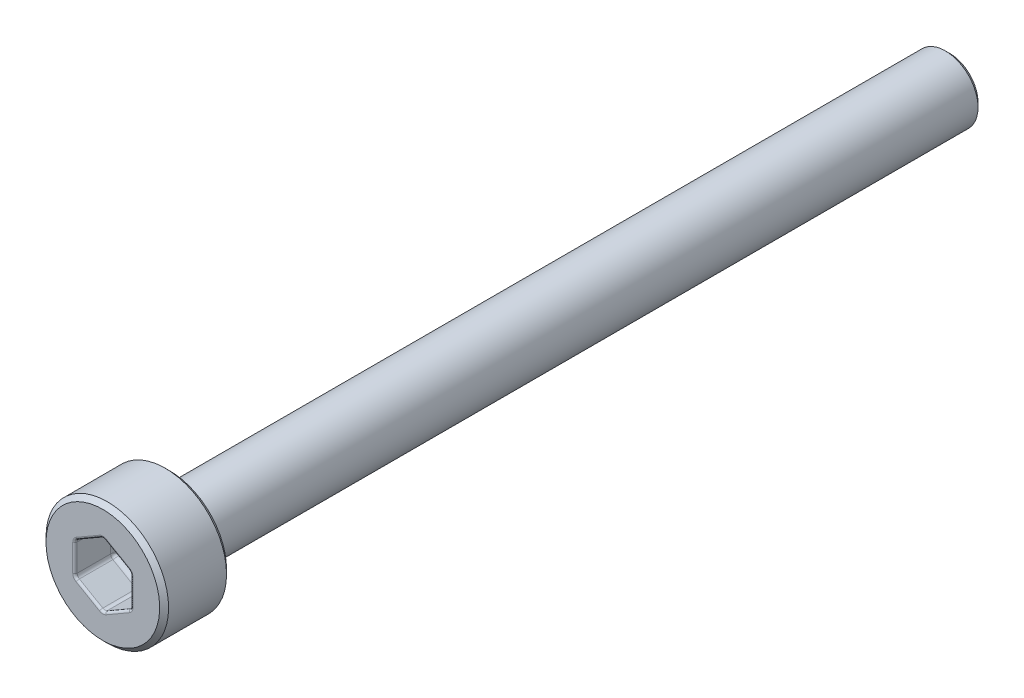
ISO-10303-21;
HEADER;
FILE_DESCRIPTION(('STEP AP214'),'2;1');
FILE_NAME('part.step','',(''),(''),'','','');
FILE_SCHEMA(('AUTOMOTIVE_DESIGN { 1 0 10303 214 1 1 1 1 }'));
ENDSEC;
DATA;
#1=APPLICATION_CONTEXT('core data for automotive mechanical design processes');
#2=APPLICATION_PROTOCOL_DEFINITION('international standard','automotive_design',2000,#1);
#3=PRODUCT_CONTEXT('',#1,'mechanical');
#4=PRODUCT('Part','Part','',(#3));
#5=PRODUCT_RELATED_PRODUCT_CATEGORY('part','',(#4));
#6=PRODUCT_DEFINITION_FORMATION('','',#4);
#7=PRODUCT_DEFINITION_CONTEXT('part definition',#1,'design');
#8=PRODUCT_DEFINITION('design','',#6,#7);
#9=PRODUCT_DEFINITION_SHAPE('','',#8);
#10=(LENGTH_UNIT() NAMED_UNIT(*) SI_UNIT(.MILLI.,.METRE.));
#11=(NAMED_UNIT(*) PLANE_ANGLE_UNIT() SI_UNIT($,.RADIAN.));
#12=(NAMED_UNIT(*) SI_UNIT($,.STERADIAN.) SOLID_ANGLE_UNIT());
#13=UNCERTAINTY_MEASURE_WITH_UNIT(LENGTH_MEASURE(1.E-05),#10,'distance_accuracy_value','');
#14=(GEOMETRIC_REPRESENTATION_CONTEXT(3) GLOBAL_UNCERTAINTY_ASSIGNED_CONTEXT((#13)) GLOBAL_UNIT_ASSIGNED_CONTEXT((#10,
#11,#12)) REPRESENTATION_CONTEXT('',''));
#15=CARTESIAN_POINT('',(0.,0.,0.));
#16=DIRECTION('',(0.,0.,1.));
#17=DIRECTION('',(1.,0.,0.));
#18=AXIS2_PLACEMENT_3D('',#15,#16,#17);
#19=CARTESIAN_POINT('',(0.,0.,3.));
#20=DIRECTION('',(0.,0.,-1.));
#21=DIRECTION('',(-1.,0.,0.));
#22=AXIS2_PLACEMENT_3D('',#19,#20,#21);
#23=PLANE('',#22);
#24=DIRECTION('',(0.,1.,0.));
#25=VECTOR('',#24,1.);
#26=CARTESIAN_POINT('',(1.35,0.,3.));
#27=LINE('',#26,#25);
#28=CARTESIAN_POINT('',(1.35,0.606217782649108,3.));
#29=VERTEX_POINT('',#28);
#30=CARTESIAN_POINT('',(1.35,-0.606217782649109,3.));
#31=VERTEX_POINT('',#30);
#32=EDGE_CURVE('E265',#29,#31,#27,.F.);
#33=ORIENTED_EDGE('',*,*,#32,.T.);
#34=CARTESIAN_POINT('',(1.05,-0.606217782649109,3.));
#35=DIRECTION('',(0.,0.,-1.));
#36=DIRECTION('',(-1.,0.,0.));
#37=AXIS2_PLACEMENT_3D('',#34,#35,#36);
#38=CIRCLE('',#37,0.3);
#39=CARTESIAN_POINT('',(1.2,-0.866025403784441,3.));
#40=VERTEX_POINT('',#39);
#41=EDGE_CURVE('E330',#31,#40,#38,.T.);
#42=ORIENTED_EDGE('',*,*,#41,.T.);
#43=DIRECTION('',(0.866025403784439,0.499999999999999,0.));
#44=VECTOR('',#43,1.);
#45=CARTESIAN_POINT('',(0.675,-1.16913429510899,3.));
#46=LINE('',#45,#44);
#47=CARTESIAN_POINT('',(0.15,-1.47224318643355,3.));
#48=VERTEX_POINT('',#47);
#49=EDGE_CURVE('E328',#40,#48,#46,.F.);
#50=ORIENTED_EDGE('',*,*,#49,.T.);
#51=CARTESIAN_POINT('',(0.,-1.21243556529821,3.));
#52=DIRECTION('',(0.,0.,-1.));
#53=DIRECTION('',(-1.,0.,0.));
#54=AXIS2_PLACEMENT_3D('',#51,#52,#53);
#55=CIRCLE('',#54,0.3);
#56=CARTESIAN_POINT('',(-0.15,-1.47224318643355,3.));
#57=VERTEX_POINT('',#56);
#58=EDGE_CURVE('E326',#48,#57,#55,.T.);
#59=ORIENTED_EDGE('',*,*,#58,.T.);
#60=DIRECTION('',(0.866025403784438,-0.500000000000001,0.));
#61=VECTOR('',#60,1.);
#62=CARTESIAN_POINT('',(-0.675000000000001,-1.16913429510899,3.));
#63=LINE('',#62,#61);
#64=CARTESIAN_POINT('',(-1.2,-0.866025403784438,3.));
#65=VERTEX_POINT('',#64);
#66=EDGE_CURVE('E324',#57,#65,#63,.F.);
#67=ORIENTED_EDGE('',*,*,#66,.T.);
#68=CARTESIAN_POINT('',(-1.05,-0.606217782649107,3.));
#69=DIRECTION('',(0.,0.,-1.));
#70=DIRECTION('',(-1.,0.,0.));
#71=AXIS2_PLACEMENT_3D('',#68,#69,#70);
#72=CIRCLE('',#71,0.3);
#73=CARTESIAN_POINT('',(-1.35,-0.606217782649107,3.));
#74=VERTEX_POINT('',#73);
#75=EDGE_CURVE('E322',#65,#74,#72,.T.);
#76=ORIENTED_EDGE('',*,*,#75,.T.);
#77=DIRECTION('',(0.,-1.,0.));
#78=VECTOR('',#77,1.);
#79=CARTESIAN_POINT('',(-1.35,0.,3.));
#80=LINE('',#79,#78);
#81=CARTESIAN_POINT('',(-1.35,0.606217782649109,3.));
#82=VERTEX_POINT('',#81);
#83=EDGE_CURVE('E320',#74,#82,#80,.F.);
#84=ORIENTED_EDGE('',*,*,#83,.T.);
#85=CARTESIAN_POINT('',(-1.05,0.606217782649109,3.));
#86=DIRECTION('',(0.,0.,-1.));
#87=DIRECTION('',(-1.,0.,0.));
#88=AXIS2_PLACEMENT_3D('',#85,#86,#87);
#89=CIRCLE('',#88,0.3);
#90=CARTESIAN_POINT('',(-1.2,0.86602540378444,3.));
#91=VERTEX_POINT('',#90);
#92=EDGE_CURVE('E318',#82,#91,#89,.T.);
#93=ORIENTED_EDGE('',*,*,#92,.T.);
#94=DIRECTION('',(-0.866025403784439,-0.5,0.));
#95=VECTOR('',#94,1.);
#96=CARTESIAN_POINT('',(-0.675,1.16913429510899,3.));
#97=LINE('',#96,#95);
#98=CARTESIAN_POINT('',(-0.149999999999999,1.47224318643355,3.));
#99=VERTEX_POINT('',#98);
#100=EDGE_CURVE('E316',#91,#99,#97,.F.);
#101=ORIENTED_EDGE('',*,*,#100,.T.);
#102=CARTESIAN_POINT('',(0.,1.21243556529822,3.));
#103=DIRECTION('',(0.,0.,-1.));
#104=DIRECTION('',(-1.,0.,0.));
#105=AXIS2_PLACEMENT_3D('',#102,#103,#104);
#106=CIRCLE('',#105,0.3);
#107=CARTESIAN_POINT('',(0.150000000000001,1.47224318643355,3.));
#108=VERTEX_POINT('',#107);
#109=EDGE_CURVE('E314',#99,#108,#106,.T.);
#110=ORIENTED_EDGE('',*,*,#109,.T.);
#111=DIRECTION('',(-0.866025403784438,0.5,0.));
#112=VECTOR('',#111,1.);
#113=CARTESIAN_POINT('',(0.675000000000001,1.16913429510899,3.));
#114=LINE('',#113,#112);
#115=CARTESIAN_POINT('',(1.2,0.86602540378444,3.));
#116=VERTEX_POINT('',#115);
#117=EDGE_CURVE('E312',#108,#116,#114,.F.);
#118=ORIENTED_EDGE('',*,*,#117,.T.);
#119=CARTESIAN_POINT('',(1.05,0.606217782649108,3.));
#120=DIRECTION('',(0.,0.,-1.));
#121=DIRECTION('',(-1.,0.,0.));
#122=AXIS2_PLACEMENT_3D('',#119,#120,#121);
#123=CIRCLE('',#122,0.3);
#124=EDGE_CURVE('E310',#116,#29,#123,.T.);
#125=ORIENTED_EDGE('',*,*,#124,.T.);
#126=EDGE_LOOP('',(#33,#42,#50,#59,#67,#76,#84,#93,#101,#110,#118,#125));
#127=FACE_BOUND('',#126,.T.);
#128=CARTESIAN_POINT('',(0.,0.,3.));
#129=DIRECTION('',(0.,0.,-1.));
#130=DIRECTION('',(-1.,0.,0.));
#131=AXIS2_PLACEMENT_3D('',#128,#129,#130);
#132=CIRCLE('',#131,2.55);
#133=CARTESIAN_POINT('',(-2.55,0.,3.));
#134=VERTEX_POINT('',#133);
#135=EDGE_CURVE('E308',#134,#134,#132,.F.);
#136=ORIENTED_EDGE('',*,*,#135,.T.);
#137=EDGE_LOOP('',(#136));
#138=FACE_BOUND('',#137,.T.);
#139=ADVANCED_FACE('F36',(#127,#138),#23,.F.);
#140=CARTESIAN_POINT('',(0.,0.,21.9198795180723));
#141=DIRECTION('',(0.,0.,1.));
#142=DIRECTION('',(1.,0.,0.));
#143=AXIS2_PLACEMENT_3D('',#140,#141,#142);
#144=CYLINDRICAL_SURFACE('',#143,2.75);
#145=CARTESIAN_POINT('',(0.,0.,2.8));
#146=DIRECTION('',(0.,0.,-1.));
#147=DIRECTION('',(-1.,0.,0.));
#148=AXIS2_PLACEMENT_3D('',#145,#146,#147);
#149=CIRCLE('',#148,2.75);
#150=CARTESIAN_POINT('',(-2.75,0.,2.8));
#151=VERTEX_POINT('',#150);
#152=EDGE_CURVE('E870',#151,#151,#149,.T.);
#153=ORIENTED_EDGE('',*,*,#152,.T.);
#154=EDGE_LOOP('',(#153));
#155=FACE_BOUND('',#154,.T.);
#156=CARTESIAN_POINT('',(0.,0.,0.200000000000002));
#157=DIRECTION('',(0.,0.,1.));
#158=DIRECTION('',(1.,0.,0.));
#159=AXIS2_PLACEMENT_3D('',#156,#157,#158);
#160=CIRCLE('',#159,2.75);
#161=CARTESIAN_POINT('',(2.75,0.,0.200000000000002));
#162=VERTEX_POINT('',#161);
#163=EDGE_CURVE('E875',#162,#162,#160,.T.);
#164=ORIENTED_EDGE('',*,*,#163,.T.);
#165=EDGE_LOOP('',(#164));
#166=FACE_BOUND('',#165,.T.);
#167=ADVANCED_FACE('F429',(#155,#166),#144,.T.);
#168=CARTESIAN_POINT('',(0.,2.75,0.));
#169=DIRECTION('',(0.,0.,1.));
#170=DIRECTION('',(1.,0.,0.));
#171=AXIS2_PLACEMENT_3D('',#168,#169,#170);
#172=PLANE('',#171);
#173=CARTESIAN_POINT('',(0.,0.,0.));
#174=DIRECTION('',(0.,0.,1.));
#175=DIRECTION('',(1.,0.,0.));
#176=AXIS2_PLACEMENT_3D('',#173,#174,#175);
#177=CIRCLE('',#176,1.665);
#178=CARTESIAN_POINT('',(1.665,0.,0.));
#179=VERTEX_POINT('',#178);
#180=EDGE_CURVE('E260',#179,#179,#177,.T.);
#181=ORIENTED_EDGE('',*,*,#180,.T.);
#182=EDGE_LOOP('',(#181));
#183=FACE_BOUND('',#182,.T.);
#184=CARTESIAN_POINT('',(0.,0.,0.));
#185=DIRECTION('',(0.,0.,1.));
#186=DIRECTION('',(1.,0.,0.));
#187=AXIS2_PLACEMENT_3D('',#184,#185,#186);
#188=CIRCLE('',#187,2.55);
#189=CARTESIAN_POINT('',(2.55,0.,0.));
#190=VERTEX_POINT('',#189);
#191=EDGE_CURVE('E868',#190,#190,#188,.F.);
#192=ORIENTED_EDGE('',*,*,#191,.T.);
#193=EDGE_LOOP('',(#192));
#194=FACE_BOUND('',#193,.T.);
#195=ADVANCED_FACE('F435',(#183,#194),#172,.F.);
#196=CARTESIAN_POINT('',(0.,0.,21.9198795180723));
#197=DIRECTION('',(0.,0.,1.));
#198=DIRECTION('',(1.,0.,0.));
#199=AXIS2_PLACEMENT_3D('',#196,#197,#198);
#200=CYLINDRICAL_SURFACE('',#199,1.465);
#201=CARTESIAN_POINT('',(0.,0.,-0.200000000000002));
#202=DIRECTION('',(0.,0.,1.));
#203=DIRECTION('',(1.,0.,0.));
#204=AXIS2_PLACEMENT_3D('',#201,#202,#203);
#205=CIRCLE('',#204,1.465);
#206=CARTESIAN_POINT('',(1.465,0.,-0.200000000000002));
#207=VERTEX_POINT('',#206);
#208=EDGE_CURVE('E263',#207,#207,#205,.F.);
#209=ORIENTED_EDGE('',*,*,#208,.T.);
#210=EDGE_LOOP('',(#209));
#211=FACE_BOUND('',#210,.T.);
#212=CARTESIAN_POINT('',(0.,0.,-34.8));
#213=DIRECTION('',(0.,0.,1.));
#214=DIRECTION('',(1.,0.,0.));
#215=AXIS2_PLACEMENT_3D('',#212,#213,#214);
#216=CIRCLE('',#215,1.465);
#217=CARTESIAN_POINT('',(1.465,0.,-34.8));
#218=VERTEX_POINT('',#217);
#219=EDGE_CURVE('E869',#218,#218,#216,.T.);
#220=ORIENTED_EDGE('',*,*,#219,.T.);
#221=EDGE_LOOP('',(#220));
#222=FACE_BOUND('',#221,.T.);
#223=ADVANCED_FACE('F810',(#211,#222),#200,.T.);
#224=CARTESIAN_POINT('',(0.,1.465,-35.));
#225=DIRECTION('',(0.,0.,1.));
#226=DIRECTION('',(1.,0.,0.));
#227=AXIS2_PLACEMENT_3D('',#224,#225,#226);
#228=PLANE('',#227);
#229=CARTESIAN_POINT('',(0.,0.,-35.));
#230=DIRECTION('',(0.,0.,1.));
#231=DIRECTION('',(1.,0.,0.));
#232=AXIS2_PLACEMENT_3D('',#229,#230,#231);
#233=CIRCLE('',#232,1.26499999999999);
#234=CARTESIAN_POINT('',(1.26499999999999,0.,-35.));
#235=VERTEX_POINT('',#234);
#236=EDGE_CURVE('E210',#235,#235,#233,.F.);
#237=ORIENTED_EDGE('',*,*,#236,.T.);
#238=EDGE_LOOP('',(#237));
#239=FACE_BOUND('',#238,.T.);
#240=ADVANCED_FACE('F802',(#239),#228,.F.);
#241=CARTESIAN_POINT('',(0.,-1.44337567297407,1.2));
#242=DIRECTION('',(0.499999999999999,-0.866025403784439,0.));
#243=DIRECTION('',(0.866025403784439,0.499999999999999,0.));
#244=AXIS2_PLACEMENT_3D('',#241,#242,#243);
#245=PLANE('',#244);
#246=DIRECTION('',(0.,0.,1.));
#247=VECTOR('',#246,1.);
#248=CARTESIAN_POINT('',(0.0999999999999997,-1.3856406460551,3.));
#249=LINE('',#248,#247);
#250=CARTESIAN_POINT('',(0.0999999999999997,-1.3856406460551,1.4));
#251=VERTEX_POINT('',#250);
#252=CARTESIAN_POINT('',(0.0999999999999997,-1.3856406460551,2.9));
#253=VERTEX_POINT('',#252);
#254=EDGE_CURVE('E257',#251,#253,#249,.T.);
#255=ORIENTED_EDGE('',*,*,#254,.T.);
#256=DIRECTION('',(0.866025403784439,0.499999999999999,0.));
#257=VECTOR('',#256,1.);
#258=CARTESIAN_POINT('',(0.,-1.44337567297407,2.9));
#259=LINE('',#258,#257);
#260=CARTESIAN_POINT('',(1.15,-0.779422863405997,2.9));
#261=VERTEX_POINT('',#260);
#262=EDGE_CURVE('E336',#253,#261,#259,.T.);
#263=ORIENTED_EDGE('',*,*,#262,.T.);
#264=DIRECTION('',(0.,0.,1.));
#265=VECTOR('',#264,1.);
#266=CARTESIAN_POINT('',(1.15,-0.779422863405997,1.2));
#267=LINE('',#266,#265);
#268=CARTESIAN_POINT('',(1.15,-0.779422863405997,1.4));
#269=VERTEX_POINT('',#268);
#270=EDGE_CURVE('E253',#261,#269,#267,.F.);
#271=ORIENTED_EDGE('',*,*,#270,.T.);
#272=DIRECTION('',(0.866025403784439,0.499999999999999,0.));
#273=VECTOR('',#272,1.);
#274=CARTESIAN_POINT('',(0.,-1.44337567297407,1.4));
#275=LINE('',#274,#273);
#276=EDGE_CURVE('E255',#269,#251,#275,.F.);
#277=ORIENTED_EDGE('',*,*,#276,.T.);
#278=EDGE_LOOP('',(#255,#263,#271,#277));
#279=FACE_BOUND('',#278,.T.);
#280=ADVANCED_FACE('F793',(#279),#245,.F.);
#281=CARTESIAN_POINT('',(-1.25,-0.721687836487032,1.2));
#282=DIRECTION('',(-0.5,-0.866025403784438,0.));
#283=DIRECTION('',(0.866025403784438,-0.500000000000001,0.));
#284=AXIS2_PLACEMENT_3D('',#281,#282,#283);
#285=PLANE('',#284);
#286=DIRECTION('',(0.,0.,1.));
#287=VECTOR('',#286,1.);
#288=CARTESIAN_POINT('',(-1.15,-0.779422863405994,3.));
#289=LINE('',#288,#287);
#290=CARTESIAN_POINT('',(-1.15,-0.779422863405994,1.4));
#291=VERTEX_POINT('',#290);
#292=CARTESIAN_POINT('',(-1.15,-0.779422863405994,2.9));
#293=VERTEX_POINT('',#292);
#294=EDGE_CURVE('E224',#291,#293,#289,.T.);
#295=ORIENTED_EDGE('',*,*,#294,.T.);
#296=DIRECTION('',(0.866025403784438,-0.500000000000001,0.));
#297=VECTOR('',#296,1.);
#298=CARTESIAN_POINT('',(-1.25,-0.721687836487032,2.9));
#299=LINE('',#298,#297);
#300=CARTESIAN_POINT('',(-0.1,-1.3856406460551,2.9));
#301=VERTEX_POINT('',#300);
#302=EDGE_CURVE('E340',#293,#301,#299,.T.);
#303=ORIENTED_EDGE('',*,*,#302,.T.);
#304=DIRECTION('',(0.,0.,1.));
#305=VECTOR('',#304,1.);
#306=CARTESIAN_POINT('',(-0.1,-1.3856406460551,1.2));
#307=LINE('',#306,#305);
#308=CARTESIAN_POINT('',(-0.1,-1.3856406460551,1.4));
#309=VERTEX_POINT('',#308);
#310=EDGE_CURVE('E216',#301,#309,#307,.F.);
#311=ORIENTED_EDGE('',*,*,#310,.T.);
#312=DIRECTION('',(0.866025403784438,-0.500000000000001,0.));
#313=VECTOR('',#312,1.);
#314=CARTESIAN_POINT('',(-1.25,-0.721687836487032,1.4));
#315=LINE('',#314,#313);
#316=EDGE_CURVE('E187',#309,#291,#315,.F.);
#317=ORIENTED_EDGE('',*,*,#316,.T.);
#318=EDGE_LOOP('',(#295,#303,#311,#317));
#319=FACE_BOUND('',#318,.T.);
#320=ADVANCED_FACE('F785',(#319),#285,.F.);
#321=CARTESIAN_POINT('',(-1.25,0.721687836487034,1.2));
#322=DIRECTION('',(-1.,0.,0.));
#323=DIRECTION('',(0.,-1.,0.));
#324=AXIS2_PLACEMENT_3D('',#321,#322,#323);
#325=PLANE('',#324);
#326=DIRECTION('',(0.,0.,1.));
#327=VECTOR('',#326,1.);
#328=CARTESIAN_POINT('',(-1.25,0.606217782649109,3.));
#329=LINE('',#328,#327);
#330=CARTESIAN_POINT('',(-1.25,0.606217782649109,1.4));
#331=VERTEX_POINT('',#330);
#332=CARTESIAN_POINT('',(-1.25,0.606217782649109,2.9));
#333=VERTEX_POINT('',#332);
#334=EDGE_CURVE('E227',#331,#333,#329,.T.);
#335=ORIENTED_EDGE('',*,*,#334,.T.);
#336=DIRECTION('',(0.,-1.,0.));
#337=VECTOR('',#336,1.);
#338=CARTESIAN_POINT('',(-1.25,0.721687836487034,2.9));
#339=LINE('',#338,#337);
#340=CARTESIAN_POINT('',(-1.25,-0.606217782649107,2.9));
#341=VERTEX_POINT('',#340);
#342=EDGE_CURVE('E344',#333,#341,#339,.T.);
#343=ORIENTED_EDGE('',*,*,#342,.T.);
#344=DIRECTION('',(0.,0.,1.));
#345=VECTOR('',#344,1.);
#346=CARTESIAN_POINT('',(-1.25,-0.606217782649107,1.2));
#347=LINE('',#346,#345);
#348=CARTESIAN_POINT('',(-1.25,-0.606217782649107,1.4));
#349=VERTEX_POINT('',#348);
#350=EDGE_CURVE('E232',#341,#349,#347,.F.);
#351=ORIENTED_EDGE('',*,*,#350,.T.);
#352=DIRECTION('',(0.,-1.,0.));
#353=VECTOR('',#352,1.);
#354=CARTESIAN_POINT('',(-1.25,0.721687836487034,1.4));
#355=LINE('',#354,#353);
#356=EDGE_CURVE('E230',#349,#331,#355,.F.);
#357=ORIENTED_EDGE('',*,*,#356,.T.);
#358=EDGE_LOOP('',(#335,#343,#351,#357));
#359=FACE_BOUND('',#358,.T.);
#360=ADVANCED_FACE('F404',(#359),#325,.F.);
#361=CARTESIAN_POINT('',(0.,1.44337567297407,1.2));
#362=DIRECTION('',(-0.5,0.866025403784439,0.));
#363=DIRECTION('',(-0.866025403784439,-0.5,0.));
#364=AXIS2_PLACEMENT_3D('',#361,#362,#363);
#365=PLANE('',#364);
#366=DIRECTION('',(0.,0.,1.));
#367=VECTOR('',#366,1.);
#368=CARTESIAN_POINT('',(-0.0999999999999993,1.3856406460551,3.));
#369=LINE('',#368,#367);
#370=CARTESIAN_POINT('',(-0.0999999999999993,1.3856406460551,1.4));
#371=VERTEX_POINT('',#370);
#372=CARTESIAN_POINT('',(-0.0999999999999993,1.3856406460551,2.9));
#373=VERTEX_POINT('',#372);
#374=EDGE_CURVE('E238',#371,#373,#369,.T.);
#375=ORIENTED_EDGE('',*,*,#374,.T.);
#376=DIRECTION('',(-0.866025403784439,-0.5,0.));
#377=VECTOR('',#376,1.);
#378=CARTESIAN_POINT('',(0.,1.44337567297407,2.9));
#379=LINE('',#378,#377);
#380=CARTESIAN_POINT('',(-1.15,0.779422863405996,2.9));
#381=VERTEX_POINT('',#380);
#382=EDGE_CURVE('E348',#373,#381,#379,.T.);
#383=ORIENTED_EDGE('',*,*,#382,.T.);
#384=DIRECTION('',(0.,0.,1.));
#385=VECTOR('',#384,1.);
#386=CARTESIAN_POINT('',(-1.15,0.779422863405996,1.2));
#387=LINE('',#386,#385);
#388=CARTESIAN_POINT('',(-1.15,0.779422863405996,1.4));
#389=VERTEX_POINT('',#388);
#390=EDGE_CURVE('E234',#381,#389,#387,.F.);
#391=ORIENTED_EDGE('',*,*,#390,.T.);
#392=DIRECTION('',(-0.866025403784439,-0.5,0.));
#393=VECTOR('',#392,1.);
#394=CARTESIAN_POINT('',(0.,1.44337567297407,1.4));
#395=LINE('',#394,#393);
#396=EDGE_CURVE('E236',#389,#371,#395,.F.);
#397=ORIENTED_EDGE('',*,*,#396,.T.);
#398=EDGE_LOOP('',(#375,#383,#391,#397));
#399=FACE_BOUND('',#398,.T.);
#400=ADVANCED_FACE('F768',(#399),#365,.F.);
#401=CARTESIAN_POINT('',(1.25,0.721687836487033,1.2));
#402=DIRECTION('',(0.5,0.866025403784438,0.));
#403=DIRECTION('',(-0.866025403784438,0.5,0.));
#404=AXIS2_PLACEMENT_3D('',#401,#402,#403);
#405=PLANE('',#404);
#406=DIRECTION('',(0.,0.,1.));
#407=VECTOR('',#406,1.);
#408=CARTESIAN_POINT('',(1.15,0.779422863405996,3.));
#409=LINE('',#408,#407);
#410=CARTESIAN_POINT('',(1.15,0.779422863405996,1.4));
#411=VERTEX_POINT('',#410);
#412=CARTESIAN_POINT('',(1.15,0.779422863405996,2.9));
#413=VERTEX_POINT('',#412);
#414=EDGE_CURVE('E245',#411,#413,#409,.T.);
#415=ORIENTED_EDGE('',*,*,#414,.T.);
#416=DIRECTION('',(-0.866025403784438,0.5,0.));
#417=VECTOR('',#416,1.);
#418=CARTESIAN_POINT('',(1.25,0.721687836487033,2.9));
#419=LINE('',#418,#417);
#420=CARTESIAN_POINT('',(0.100000000000001,1.3856406460551,2.9));
#421=VERTEX_POINT('',#420);
#422=EDGE_CURVE('E352',#413,#421,#419,.T.);
#423=ORIENTED_EDGE('',*,*,#422,.T.);
#424=DIRECTION('',(0.,0.,1.));
#425=VECTOR('',#424,1.);
#426=CARTESIAN_POINT('',(0.100000000000001,1.3856406460551,1.2));
#427=LINE('',#426,#425);
#428=CARTESIAN_POINT('',(0.100000000000001,1.3856406460551,1.4));
#429=VERTEX_POINT('',#428);
#430=EDGE_CURVE('E241',#421,#429,#427,.F.);
#431=ORIENTED_EDGE('',*,*,#430,.T.);
#432=DIRECTION('',(-0.866025403784438,0.5,0.));
#433=VECTOR('',#432,1.);
#434=CARTESIAN_POINT('',(1.25,0.721687836487033,1.4));
#435=LINE('',#434,#433);
#436=EDGE_CURVE('E243',#429,#411,#435,.F.);
#437=ORIENTED_EDGE('',*,*,#436,.T.);
#438=EDGE_LOOP('',(#415,#423,#431,#437));
#439=FACE_BOUND('',#438,.T.);
#440=ADVANCED_FACE('F760',(#439),#405,.F.);
#441=CARTESIAN_POINT('',(1.25,-0.721687836487034,1.2));
#442=DIRECTION('',(1.,0.,0.));
#443=DIRECTION('',(0.,1.,0.));
#444=AXIS2_PLACEMENT_3D('',#441,#442,#443);
#445=PLANE('',#444);
#446=DIRECTION('',(0.,0.,1.));
#447=VECTOR('',#446,1.);
#448=CARTESIAN_POINT('',(1.25,-0.606217782649109,3.));
#449=LINE('',#448,#447);
#450=CARTESIAN_POINT('',(1.25,-0.606217782649109,1.4));
#451=VERTEX_POINT('',#450);
#452=CARTESIAN_POINT('',(1.25,-0.606217782649109,2.9));
#453=VERTEX_POINT('',#452);
#454=EDGE_CURVE('E251',#451,#453,#449,.T.);
#455=ORIENTED_EDGE('',*,*,#454,.T.);
#456=DIRECTION('',(0.,1.,0.));
#457=VECTOR('',#456,1.);
#458=CARTESIAN_POINT('',(1.25,-0.721687836487034,2.9));
#459=LINE('',#458,#457);
#460=CARTESIAN_POINT('',(1.25,0.606217782649108,2.9));
#461=VERTEX_POINT('',#460);
#462=EDGE_CURVE('E11',#453,#461,#459,.T.);
#463=ORIENTED_EDGE('',*,*,#462,.T.);
#464=DIRECTION('',(0.,0.,1.));
#465=VECTOR('',#464,1.);
#466=CARTESIAN_POINT('',(1.25,0.606217782649108,1.2));
#467=LINE('',#466,#465);
#468=CARTESIAN_POINT('',(1.25,0.606217782649108,1.4));
#469=VERTEX_POINT('',#468);
#470=EDGE_CURVE('E247',#461,#469,#467,.F.);
#471=ORIENTED_EDGE('',*,*,#470,.T.);
#472=DIRECTION('',(0.,1.,0.));
#473=VECTOR('',#472,1.);
#474=CARTESIAN_POINT('',(1.25,-0.721687836487034,1.4));
#475=LINE('',#474,#473);
#476=EDGE_CURVE('E249',#469,#451,#475,.F.);
#477=ORIENTED_EDGE('',*,*,#476,.T.);
#478=EDGE_LOOP('',(#455,#463,#471,#477));
#479=FACE_BOUND('',#478,.T.);
#480=ADVANCED_FACE('F752',(#479),#445,.F.);
#481=CARTESIAN_POINT('',(0.,0.,1.2));
#482=DIRECTION('',(0.,0.,1.));
#483=DIRECTION('',(1.,0.,0.));
#484=AXIS2_PLACEMENT_3D('',#481,#482,#483);
#485=PLANE('',#484);
#486=DIRECTION('',(0.,-1.,0.));
#487=VECTOR('',#486,1.);
#488=CARTESIAN_POINT('',(-1.05,0.,1.2));
#489=LINE('',#488,#487);
#490=CARTESIAN_POINT('',(-1.05,0.606217782649109,1.2));
#491=VERTEX_POINT('',#490);
#492=CARTESIAN_POINT('',(-1.05,-0.606217782649107,1.2));
#493=VERTEX_POINT('',#492);
#494=EDGE_CURVE('E214',#491,#493,#489,.T.);
#495=ORIENTED_EDGE('',*,*,#494,.T.);
#496=DIRECTION('',(0.866025403784438,-0.500000000000001,0.));
#497=VECTOR('',#496,1.);
#498=CARTESIAN_POINT('',(-0.525000000000001,-0.909326673973661,1.2));
#499=LINE('',#498,#497);
#500=CARTESIAN_POINT('',(0.,-1.21243556529822,1.2));
#501=VERTEX_POINT('',#500);
#502=EDGE_CURVE('E185',#493,#501,#499,.T.);
#503=ORIENTED_EDGE('',*,*,#502,.T.);
#504=DIRECTION('',(0.866025403784439,0.499999999999999,0.));
#505=VECTOR('',#504,1.);
#506=CARTESIAN_POINT('',(0.525,-0.909326673973662,1.2));
#507=LINE('',#506,#505);
#508=CARTESIAN_POINT('',(1.05,-0.606217782649109,1.2));
#509=VERTEX_POINT('',#508);
#510=EDGE_CURVE('E203',#501,#509,#507,.T.);
#511=ORIENTED_EDGE('',*,*,#510,.T.);
#512=DIRECTION('',(0.,1.,0.));
#513=VECTOR('',#512,1.);
#514=CARTESIAN_POINT('',(1.05,0.,1.2));
#515=LINE('',#514,#513);
#516=CARTESIAN_POINT('',(1.05,0.606217782649108,1.2));
#517=VERTEX_POINT('',#516);
#518=EDGE_CURVE('E209',#509,#517,#515,.T.);
#519=ORIENTED_EDGE('',*,*,#518,.T.);
#520=DIRECTION('',(-0.866025403784438,0.5,0.));
#521=VECTOR('',#520,1.);
#522=CARTESIAN_POINT('',(0.525000000000001,0.909326673973661,1.2));
#523=LINE('',#522,#521);
#524=CARTESIAN_POINT('',(0.,1.21243556529822,1.2));
#525=VERTEX_POINT('',#524);
#526=EDGE_CURVE('E882',#517,#525,#523,.T.);
#527=ORIENTED_EDGE('',*,*,#526,.T.);
#528=DIRECTION('',(-0.866025403784439,-0.5,0.));
#529=VECTOR('',#528,1.);
#530=CARTESIAN_POINT('',(-0.525,0.909326673973662,1.2));
#531=LINE('',#530,#529);
#532=EDGE_CURVE('E219',#525,#491,#531,.T.);
#533=ORIENTED_EDGE('',*,*,#532,.T.);
#534=EDGE_LOOP('',(#495,#503,#511,#519,#527,#533));
#535=FACE_BOUND('',#534,.T.);
#536=ADVANCED_FACE('F212',(#535),#485,.T.);
#537=CARTESIAN_POINT('',(0.,0.,3.));
#538=DIRECTION('',(0.,0.,-1.));
#539=DIRECTION('',(-1.,0.,0.));
#540=AXIS2_PLACEMENT_3D('',#537,#538,#539);
#541=CONICAL_SURFACE('',#540,2.55,0.785398163397442);
#542=ORIENTED_EDGE('',*,*,#152,.F.);
#543=EDGE_LOOP('',(#542));
#544=FACE_BOUND('',#543,.T.);
#545=ORIENTED_EDGE('',*,*,#135,.F.);
#546=EDGE_LOOP('',(#545));
#547=FACE_BOUND('',#546,.T.);
#548=ADVANCED_FACE('F441',(#544,#547),#541,.T.);
#549=CARTESIAN_POINT('',(0.,0.,0.200000000000002));
#550=DIRECTION('',(0.,0.,1.));
#551=DIRECTION('',(1.,0.,0.));
#552=AXIS2_PLACEMENT_3D('',#549,#550,#551);
#553=CONICAL_SURFACE('',#552,2.75,0.78539816339745);
#554=ORIENTED_EDGE('',*,*,#191,.F.);
#555=EDGE_LOOP('',(#554));
#556=FACE_BOUND('',#555,.T.);
#557=ORIENTED_EDGE('',*,*,#163,.F.);
#558=EDGE_LOOP('',(#557));
#559=FACE_BOUND('',#558,.T.);
#560=ADVANCED_FACE('F444',(#556,#559),#553,.T.);
#561=CARTESIAN_POINT('',(0.,0.,-34.8));
#562=DIRECTION('',(0.,0.,1.));
#563=DIRECTION('',(1.,0.,0.));
#564=AXIS2_PLACEMENT_3D('',#561,#562,#563);
#565=CONICAL_SURFACE('',#564,1.465,0.785398163397429);
#566=ORIENTED_EDGE('',*,*,#236,.F.);
#567=EDGE_LOOP('',(#566));
#568=FACE_BOUND('',#567,.T.);
#569=ORIENTED_EDGE('',*,*,#219,.F.);
#570=EDGE_LOOP('',(#569));
#571=FACE_BOUND('',#570,.T.);
#572=ADVANCED_FACE('F448',(#568,#571),#565,.T.);
#573=CARTESIAN_POINT('',(0.,1.21243556529822,1.2));
#574=DIRECTION('',(0.,0.,-1.));
#575=DIRECTION('',(-1.,0.,0.));
#576=AXIS2_PLACEMENT_3D('',#573,#574,#575);
#577=CYLINDRICAL_SURFACE('',#576,0.2);
#578=ORIENTED_EDGE('',*,*,#430,.F.);
#579=CARTESIAN_POINT('',(0.,1.21243556529822,2.9));
#580=DIRECTION('',(0.,0.,-1.));
#581=DIRECTION('',(-1.,0.,0.));
#582=AXIS2_PLACEMENT_3D('',#579,#580,#581);
#583=CIRCLE('',#582,0.2);
#584=EDGE_CURVE('E350',#421,#373,#583,.F.);
#585=ORIENTED_EDGE('',*,*,#584,.T.);
#586=ORIENTED_EDGE('',*,*,#374,.F.);
#587=CARTESIAN_POINT('',(0.,1.21243556529822,1.4));
#588=DIRECTION('',(0.,0.,1.));
#589=DIRECTION('',(1.,0.,0.));
#590=AXIS2_PLACEMENT_3D('',#587,#588,#589);
#591=CIRCLE('',#590,0.2);
#592=EDGE_CURVE('E305',#429,#371,#591,.T.);
#593=ORIENTED_EDGE('',*,*,#592,.F.);
#594=EDGE_LOOP('',(#578,#585,#586,#593));
#595=FACE_BOUND('',#594,.T.);
#596=ADVANCED_FACE('F452',(#595),#577,.F.);
#597=CARTESIAN_POINT('',(0.525000000000001,0.909326673973661,1.4));
#598=DIRECTION('',(-0.866025403784438,0.5,0.));
#599=DIRECTION('',(-0.5,-0.866025403784438,0.));
#600=AXIS2_PLACEMENT_3D('',#597,#598,#599);
#601=CYLINDRICAL_SURFACE('',#600,0.2);
#602=CARTESIAN_POINT('',(1.05,0.606217782649108,1.4));
#603=DIRECTION('',(-0.866025403784438,0.5,0.));
#604=DIRECTION('',(-0.5,-0.866025403784439,0.));
#605=AXIS2_PLACEMENT_3D('',#602,#603,#604);
#606=CIRCLE('',#605,0.2);
#607=EDGE_CURVE('E299',#411,#517,#606,.T.);
#608=ORIENTED_EDGE('',*,*,#607,.F.);
#609=ORIENTED_EDGE('',*,*,#436,.F.);
#610=CARTESIAN_POINT('',(0.,1.21243556529822,1.4));
#611=DIRECTION('',(0.866025403784438,-0.500000000000001,0.));
#612=DIRECTION('',(0.500000000000001,0.866025403784438,0.));
#613=AXIS2_PLACEMENT_3D('',#610,#611,#612);
#614=CIRCLE('',#613,0.2);
#615=EDGE_CURVE('E302',#525,#429,#614,.T.);
#616=ORIENTED_EDGE('',*,*,#615,.F.);
#617=ORIENTED_EDGE('',*,*,#526,.F.);
#618=EDGE_LOOP('',(#608,#609,#616,#617));
#619=FACE_BOUND('',#618,.T.);
#620=ADVANCED_FACE('F713',(#619),#601,.F.);
#621=CARTESIAN_POINT('',(1.05,0.606217782649108,1.2));
#622=DIRECTION('',(0.,0.,-1.));
#623=DIRECTION('',(-1.,0.,0.));
#624=AXIS2_PLACEMENT_3D('',#621,#622,#623);
#625=CYLINDRICAL_SURFACE('',#624,0.2);
#626=ORIENTED_EDGE('',*,*,#470,.F.);
#627=CARTESIAN_POINT('',(1.05,0.606217782649108,2.9));
#628=DIRECTION('',(0.,0.,-1.));
#629=DIRECTION('',(-1.,0.,0.));
#630=AXIS2_PLACEMENT_3D('',#627,#628,#629);
#631=CIRCLE('',#630,0.2);
#632=EDGE_CURVE('E45',#461,#413,#631,.F.);
#633=ORIENTED_EDGE('',*,*,#632,.T.);
#634=ORIENTED_EDGE('',*,*,#414,.F.);
#635=CARTESIAN_POINT('',(1.05,0.606217782649108,1.4));
#636=DIRECTION('',(0.,0.,1.));
#637=DIRECTION('',(1.,0.,0.));
#638=AXIS2_PLACEMENT_3D('',#635,#636,#637);
#639=CIRCLE('',#638,0.2);
#640=EDGE_CURVE('E296',#469,#411,#639,.T.);
#641=ORIENTED_EDGE('',*,*,#640,.F.);
#642=EDGE_LOOP('',(#626,#633,#634,#641));
#643=FACE_BOUND('',#642,.T.);
#644=ADVANCED_FACE('F704',(#643),#625,.F.);
#645=CARTESIAN_POINT('',(0.,1.21243556529822,1.4));
#646=DIRECTION('',(0.,0.,1.));
#647=DIRECTION('',(1.,0.,0.));
#648=AXIS2_PLACEMENT_3D('',#645,#646,#647);
#649=SPHERICAL_SURFACE('',#648,0.2);
#650=ORIENTED_EDGE('',*,*,#615,.T.);
#651=ORIENTED_EDGE('',*,*,#592,.T.);
#652=CARTESIAN_POINT('',(0.,1.21243556529822,1.4));
#653=DIRECTION('',(-0.866025403784439,-0.5,0.));
#654=DIRECTION('',(0.5,-0.866025403784439,0.));
#655=AXIS2_PLACEMENT_3D('',#652,#653,#654);
#656=CIRCLE('',#655,0.2);
#657=EDGE_CURVE('E293',#525,#371,#656,.F.);
#658=ORIENTED_EDGE('',*,*,#657,.F.);
#659=EDGE_LOOP('',(#650,#651,#658));
#660=FACE_BOUND('',#659,.T.);
#661=ADVANCED_FACE('F695',(#660),#649,.F.);
#662=CARTESIAN_POINT('',(1.05,0.606217782649108,1.4));
#663=DIRECTION('',(0.,0.,1.));
#664=DIRECTION('',(1.,0.,0.));
#665=AXIS2_PLACEMENT_3D('',#662,#663,#664);
#666=SPHERICAL_SURFACE('',#665,0.2);
#667=ORIENTED_EDGE('',*,*,#640,.T.);
#668=ORIENTED_EDGE('',*,*,#607,.T.);
#669=CARTESIAN_POINT('',(1.05,0.606217782649108,1.4));
#670=DIRECTION('',(0.,-1.,0.));
#671=DIRECTION('',(0.,0.,-1.));
#672=AXIS2_PLACEMENT_3D('',#669,#670,#671);
#673=CIRCLE('',#672,0.2);
#674=EDGE_CURVE('E290',#469,#517,#673,.F.);
#675=ORIENTED_EDGE('',*,*,#674,.F.);
#676=EDGE_LOOP('',(#667,#668,#675));
#677=FACE_BOUND('',#676,.T.);
#678=ADVANCED_FACE('F687',(#677),#666,.F.);
#679=CARTESIAN_POINT('',(-1.05,0.606217782649109,1.2));
#680=DIRECTION('',(0.,0.,-1.));
#681=DIRECTION('',(-1.,0.,0.));
#682=AXIS2_PLACEMENT_3D('',#679,#680,#681);
#683=CYLINDRICAL_SURFACE('',#682,0.2);
#684=ORIENTED_EDGE('',*,*,#390,.F.);
#685=CARTESIAN_POINT('',(-1.05,0.606217782649109,2.9));
#686=DIRECTION('',(0.,0.,-1.));
#687=DIRECTION('',(-1.,0.,0.));
#688=AXIS2_PLACEMENT_3D('',#685,#686,#687);
#689=CIRCLE('',#688,0.2);
#690=EDGE_CURVE('E346',#381,#333,#689,.F.);
#691=ORIENTED_EDGE('',*,*,#690,.T.);
#692=ORIENTED_EDGE('',*,*,#334,.F.);
#693=CARTESIAN_POINT('',(-1.05,0.606217782649109,1.4));
#694=DIRECTION('',(0.,0.,1.));
#695=DIRECTION('',(1.,0.,0.));
#696=AXIS2_PLACEMENT_3D('',#693,#694,#695);
#697=CIRCLE('',#696,0.2);
#698=EDGE_CURVE('E287',#389,#331,#697,.T.);
#699=ORIENTED_EDGE('',*,*,#698,.F.);
#700=EDGE_LOOP('',(#684,#691,#692,#699));
#701=FACE_BOUND('',#700,.T.);
#702=ADVANCED_FACE('F401',(#701),#683,.F.);
#703=CARTESIAN_POINT('',(-0.525,0.909326673973662,1.4));
#704=DIRECTION('',(-0.866025403784439,-0.5,0.));
#705=DIRECTION('',(0.5,-0.866025403784439,0.));
#706=AXIS2_PLACEMENT_3D('',#703,#704,#705);
#707=CYLINDRICAL_SURFACE('',#706,0.2);
#708=ORIENTED_EDGE('',*,*,#657,.T.);
#709=ORIENTED_EDGE('',*,*,#396,.F.);
#710=CARTESIAN_POINT('',(-1.05,0.606217782649109,1.4));
#711=DIRECTION('',(0.866025403784438,0.5,0.));
#712=DIRECTION('',(-0.5,0.866025403784438,0.));
#713=AXIS2_PLACEMENT_3D('',#710,#711,#712);
#714=CIRCLE('',#713,0.2);
#715=EDGE_CURVE('E284',#491,#389,#714,.T.);
#716=ORIENTED_EDGE('',*,*,#715,.F.);
#717=ORIENTED_EDGE('',*,*,#532,.F.);
#718=EDGE_LOOP('',(#708,#709,#716,#717));
#719=FACE_BOUND('',#718,.T.);
#720=ADVANCED_FACE('F670',(#719),#707,.F.);
#721=CARTESIAN_POINT('',(1.05,0.,1.4));
#722=DIRECTION('',(0.,1.,0.));
#723=DIRECTION('',(-1.,0.,0.));
#724=AXIS2_PLACEMENT_3D('',#721,#722,#723);
#725=CYLINDRICAL_SURFACE('',#724,0.2);
#726=ORIENTED_EDGE('',*,*,#674,.T.);
#727=ORIENTED_EDGE('',*,*,#518,.F.);
#728=CARTESIAN_POINT('',(1.05,-0.606217782649109,1.4));
#729=DIRECTION('',(0.,1.,0.));
#730=DIRECTION('',(0.,0.,1.));
#731=AXIS2_PLACEMENT_3D('',#728,#729,#730);
#732=CIRCLE('',#731,0.2);
#733=EDGE_CURVE('E281',#451,#509,#732,.T.);
#734=ORIENTED_EDGE('',*,*,#733,.F.);
#735=ORIENTED_EDGE('',*,*,#476,.F.);
#736=EDGE_LOOP('',(#726,#727,#734,#735));
#737=FACE_BOUND('',#736,.T.);
#738=ADVANCED_FACE('F661',(#737),#725,.F.);
#739=CARTESIAN_POINT('',(1.05,-0.606217782649109,1.2));
#740=DIRECTION('',(0.,0.,-1.));
#741=DIRECTION('',(-1.,0.,0.));
#742=AXIS2_PLACEMENT_3D('',#739,#740,#741);
#743=CYLINDRICAL_SURFACE('',#742,0.2);
#744=ORIENTED_EDGE('',*,*,#270,.F.);
#745=CARTESIAN_POINT('',(1.05,-0.606217782649109,2.9));
#746=DIRECTION('',(0.,0.,-1.));
#747=DIRECTION('',(-1.,0.,0.));
#748=AXIS2_PLACEMENT_3D('',#745,#746,#747);
#749=CIRCLE('',#748,0.2);
#750=EDGE_CURVE('E333',#261,#453,#749,.F.);
#751=ORIENTED_EDGE('',*,*,#750,.T.);
#752=ORIENTED_EDGE('',*,*,#454,.F.);
#753=CARTESIAN_POINT('',(1.05,-0.606217782649109,1.4));
#754=DIRECTION('',(0.,0.,1.));
#755=DIRECTION('',(1.,0.,0.));
#756=AXIS2_PLACEMENT_3D('',#753,#754,#755);
#757=CIRCLE('',#756,0.2);
#758=EDGE_CURVE('E278',#269,#451,#757,.T.);
#759=ORIENTED_EDGE('',*,*,#758,.F.);
#760=EDGE_LOOP('',(#744,#751,#752,#759));
#761=FACE_BOUND('',#760,.T.);
#762=ADVANCED_FACE('F652',(#761),#743,.F.);
#763=CARTESIAN_POINT('',(-1.05,0.606217782649109,1.4));
#764=DIRECTION('',(0.,0.,1.));
#765=DIRECTION('',(1.,0.,0.));
#766=AXIS2_PLACEMENT_3D('',#763,#764,#765);
#767=SPHERICAL_SURFACE('',#766,0.2);
#768=ORIENTED_EDGE('',*,*,#715,.T.);
#769=ORIENTED_EDGE('',*,*,#698,.T.);
#770=CARTESIAN_POINT('',(-1.05,0.606217782649109,1.4));
#771=DIRECTION('',(0.,-1.,0.));
#772=DIRECTION('',(0.,0.,-1.));
#773=AXIS2_PLACEMENT_3D('',#770,#771,#772);
#774=CIRCLE('',#773,0.2);
#775=EDGE_CURVE('E275',#491,#331,#774,.F.);
#776=ORIENTED_EDGE('',*,*,#775,.F.);
#777=EDGE_LOOP('',(#768,#769,#776));
#778=FACE_BOUND('',#777,.T.);
#779=ADVANCED_FACE('F643',(#778),#767,.F.);
#780=CARTESIAN_POINT('',(1.05,-0.606217782649109,1.4));
#781=DIRECTION('',(0.,0.,1.));
#782=DIRECTION('',(1.,0.,0.));
#783=AXIS2_PLACEMENT_3D('',#780,#781,#782);
#784=SPHERICAL_SURFACE('',#783,0.2);
#785=ORIENTED_EDGE('',*,*,#758,.T.);
#786=ORIENTED_EDGE('',*,*,#733,.T.);
#787=CARTESIAN_POINT('',(1.05,-0.606217782649109,1.4));
#788=DIRECTION('',(-0.866025403784439,-0.5,0.));
#789=DIRECTION('',(0.5,-0.866025403784439,0.));
#790=AXIS2_PLACEMENT_3D('',#787,#788,#789);
#791=CIRCLE('',#790,0.2);
#792=EDGE_CURVE('E206',#269,#509,#791,.F.);
#793=ORIENTED_EDGE('',*,*,#792,.F.);
#794=EDGE_LOOP('',(#785,#786,#793));
#795=FACE_BOUND('',#794,.T.);
#796=ADVANCED_FACE('F635',(#795),#784,.F.);
#797=CARTESIAN_POINT('',(-1.05,-0.606217782649107,1.2));
#798=DIRECTION('',(0.,0.,-1.));
#799=DIRECTION('',(-1.,0.,0.));
#800=AXIS2_PLACEMENT_3D('',#797,#798,#799);
#801=CYLINDRICAL_SURFACE('',#800,0.2);
#802=ORIENTED_EDGE('',*,*,#350,.F.);
#803=CARTESIAN_POINT('',(-1.05,-0.606217782649107,2.9));
#804=DIRECTION('',(0.,0.,-1.));
#805=DIRECTION('',(-1.,0.,0.));
#806=AXIS2_PLACEMENT_3D('',#803,#804,#805);
#807=CIRCLE('',#806,0.2);
#808=EDGE_CURVE('E342',#341,#293,#807,.F.);
#809=ORIENTED_EDGE('',*,*,#808,.T.);
#810=ORIENTED_EDGE('',*,*,#294,.F.);
#811=CARTESIAN_POINT('',(-1.05,-0.606217782649107,1.4));
#812=DIRECTION('',(0.,0.,1.));
#813=DIRECTION('',(1.,0.,0.));
#814=AXIS2_PLACEMENT_3D('',#811,#812,#813);
#815=CIRCLE('',#814,0.2);
#816=EDGE_CURVE('E271',#349,#291,#815,.T.);
#817=ORIENTED_EDGE('',*,*,#816,.F.);
#818=EDGE_LOOP('',(#802,#809,#810,#817));
#819=FACE_BOUND('',#818,.T.);
#820=ADVANCED_FACE('F414',(#819),#801,.F.);
#821=CARTESIAN_POINT('',(-1.05,0.,1.4));
#822=DIRECTION('',(0.,-1.,0.));
#823=DIRECTION('',(1.,0.,0.));
#824=AXIS2_PLACEMENT_3D('',#821,#822,#823);
#825=CYLINDRICAL_SURFACE('',#824,0.2);
#826=ORIENTED_EDGE('',*,*,#775,.T.);
#827=ORIENTED_EDGE('',*,*,#356,.F.);
#828=CARTESIAN_POINT('',(-1.05,-0.606217782649107,1.4));
#829=DIRECTION('',(0.,1.,0.));
#830=DIRECTION('',(-1.,0.,0.));
#831=AXIS2_PLACEMENT_3D('',#828,#829,#830);
#832=CIRCLE('',#831,0.2);
#833=EDGE_CURVE('E200',#493,#349,#832,.T.);
#834=ORIENTED_EDGE('',*,*,#833,.F.);
#835=ORIENTED_EDGE('',*,*,#494,.F.);
#836=EDGE_LOOP('',(#826,#827,#834,#835));
#837=FACE_BOUND('',#836,.T.);
#838=ADVANCED_FACE('F409',(#837),#825,.F.);
#839=CARTESIAN_POINT('',(0.525,-0.909326673973662,1.4));
#840=DIRECTION('',(0.866025403784439,0.499999999999999,0.));
#841=DIRECTION('',(-0.499999999999999,0.866025403784439,0.));
#842=AXIS2_PLACEMENT_3D('',#839,#840,#841);
#843=CYLINDRICAL_SURFACE('',#842,0.2);
#844=ORIENTED_EDGE('',*,*,#792,.T.);
#845=ORIENTED_EDGE('',*,*,#510,.F.);
#846=CARTESIAN_POINT('',(0.,-1.21243556529821,1.4));
#847=DIRECTION('',(0.866025403784439,0.499999999999999,0.));
#848=DIRECTION('',(-0.499999999999999,0.866025403784439,0.));
#849=AXIS2_PLACEMENT_3D('',#846,#847,#848);
#850=CIRCLE('',#849,0.2);
#851=EDGE_CURVE('E193',#251,#501,#850,.T.);
#852=ORIENTED_EDGE('',*,*,#851,.F.);
#853=ORIENTED_EDGE('',*,*,#276,.F.);
#854=EDGE_LOOP('',(#844,#845,#852,#853));
#855=FACE_BOUND('',#854,.T.);
#856=ADVANCED_FACE('F204',(#855),#843,.F.);
#857=CARTESIAN_POINT('',(0.,-1.21243556529821,1.2));
#858=DIRECTION('',(0.,0.,-1.));
#859=DIRECTION('',(-1.,0.,0.));
#860=AXIS2_PLACEMENT_3D('',#857,#858,#859);
#861=CYLINDRICAL_SURFACE('',#860,0.2);
#862=ORIENTED_EDGE('',*,*,#310,.F.);
#863=CARTESIAN_POINT('',(0.,-1.21243556529821,2.9));
#864=DIRECTION('',(0.,0.,-1.));
#865=DIRECTION('',(-1.,0.,0.));
#866=AXIS2_PLACEMENT_3D('',#863,#864,#865);
#867=CIRCLE('',#866,0.2);
#868=EDGE_CURVE('E338',#301,#253,#867,.F.);
#869=ORIENTED_EDGE('',*,*,#868,.T.);
#870=ORIENTED_EDGE('',*,*,#254,.F.);
#871=CARTESIAN_POINT('',(0.,-1.21243556529821,1.4));
#872=DIRECTION('',(0.,0.,1.));
#873=DIRECTION('',(1.,0.,0.));
#874=AXIS2_PLACEMENT_3D('',#871,#872,#873);
#875=CIRCLE('',#874,0.2);
#876=EDGE_CURVE('E197',#309,#251,#875,.T.);
#877=ORIENTED_EDGE('',*,*,#876,.F.);
#878=EDGE_LOOP('',(#862,#869,#870,#877));
#879=FACE_BOUND('',#878,.T.);
#880=ADVANCED_FACE('F419',(#879),#861,.F.);
#881=CARTESIAN_POINT('',(-1.05,-0.606217782649107,1.4));
#882=DIRECTION('',(0.,0.,1.));
#883=DIRECTION('',(1.,0.,0.));
#884=AXIS2_PLACEMENT_3D('',#881,#882,#883);
#885=SPHERICAL_SURFACE('',#884,0.2);
#886=ORIENTED_EDGE('',*,*,#833,.T.);
#887=ORIENTED_EDGE('',*,*,#816,.T.);
#888=CARTESIAN_POINT('',(-1.05,-0.606217782649107,1.4));
#889=DIRECTION('',(0.866025403784438,-0.5,0.));
#890=DIRECTION('',(0.5,0.866025403784439,0.));
#891=AXIS2_PLACEMENT_3D('',#888,#889,#890);
#892=CIRCLE('',#891,0.2);
#893=EDGE_CURVE('E190',#493,#291,#892,.F.);
#894=ORIENTED_EDGE('',*,*,#893,.F.);
#895=EDGE_LOOP('',(#886,#887,#894));
#896=FACE_BOUND('',#895,.T.);
#897=ADVANCED_FACE('F417',(#896),#885,.F.);
#898=CARTESIAN_POINT('',(0.,-1.21243556529821,1.4));
#899=DIRECTION('',(0.,0.,1.));
#900=DIRECTION('',(1.,0.,0.));
#901=AXIS2_PLACEMENT_3D('',#898,#899,#900);
#902=SPHERICAL_SURFACE('',#901,0.2);
#903=ORIENTED_EDGE('',*,*,#876,.T.);
#904=ORIENTED_EDGE('',*,*,#851,.T.);
#905=CARTESIAN_POINT('',(0.,-1.21243556529822,1.4));
#906=DIRECTION('',(-0.866025403784438,0.500000000000001,0.));
#907=DIRECTION('',(-0.500000000000002,-0.866025403784438,0.));
#908=AXIS2_PLACEMENT_3D('',#905,#906,#907);
#909=CIRCLE('',#908,0.2);
#910=EDGE_CURVE('E181',#309,#501,#909,.F.);
#911=ORIENTED_EDGE('',*,*,#910,.F.);
#912=EDGE_LOOP('',(#903,#904,#911));
#913=FACE_BOUND('',#912,.T.);
#914=ADVANCED_FACE('F195',(#913),#902,.F.);
#915=CARTESIAN_POINT('',(-0.525000000000001,-0.909326673973661,1.4));
#916=DIRECTION('',(0.866025403784438,-0.500000000000001,0.));
#917=DIRECTION('',(0.500000000000001,0.866025403784438,0.));
#918=AXIS2_PLACEMENT_3D('',#915,#916,#917);
#919=CYLINDRICAL_SURFACE('',#918,0.2);
#920=ORIENTED_EDGE('',*,*,#893,.T.);
#921=ORIENTED_EDGE('',*,*,#316,.F.);
#922=ORIENTED_EDGE('',*,*,#910,.T.);
#923=ORIENTED_EDGE('',*,*,#502,.F.);
#924=EDGE_LOOP('',(#920,#921,#922,#923));
#925=FACE_BOUND('',#924,.T.);
#926=ADVANCED_FACE('F183',(#925),#919,.F.);
#927=CARTESIAN_POINT('',(0.,0.,-0.200000000000002));
#928=DIRECTION('',(0.,0.,1.));
#929=DIRECTION('',(1.,0.,0.));
#930=AXIS2_PLACEMENT_3D('',#927,#928,#929);
#931=TOROIDAL_SURFACE('',#930,1.665,0.2);
#932=ORIENTED_EDGE('',*,*,#208,.F.);
#933=EDGE_LOOP('',(#932));
#934=FACE_BOUND('',#933,.T.);
#935=ORIENTED_EDGE('',*,*,#180,.F.);
#936=EDGE_LOOP('',(#935));
#937=FACE_BOUND('',#936,.T.);
#938=ADVANCED_FACE('F455',(#934,#937),#931,.F.);
#939=CARTESIAN_POINT('',(-1.05,0.606217782649109,2.9));
#940=DIRECTION('',(0.,0.,-1.));
#941=DIRECTION('',(-1.,0.,0.));
#942=AXIS2_PLACEMENT_3D('',#939,#940,#941);
#943=TOROIDAL_SURFACE('',#942,0.3,0.1);
#944=CARTESIAN_POINT('',(-1.35,0.606217782649109,2.9));
#945=DIRECTION('',(0.,-1.,0.));
#946=DIRECTION('',(0.,0.,-1.));
#947=AXIS2_PLACEMENT_3D('',#944,#945,#946);
#948=CIRCLE('',#947,0.1);
#949=EDGE_CURVE('E382',#333,#82,#948,.T.);
#950=ORIENTED_EDGE('',*,*,#949,.F.);
#951=ORIENTED_EDGE('',*,*,#690,.F.);
#952=CARTESIAN_POINT('',(-1.2,0.86602540378444,2.9));
#953=DIRECTION('',(0.866025403784439,0.499999999999999,0.));
#954=DIRECTION('',(-0.499999999999999,0.866025403784439,0.));
#955=AXIS2_PLACEMENT_3D('',#952,#953,#954);
#956=CIRCLE('',#955,0.1);
#957=EDGE_CURVE('E40',#91,#381,#956,.T.);
#958=ORIENTED_EDGE('',*,*,#957,.F.);
#959=ORIENTED_EDGE('',*,*,#92,.F.);
#960=EDGE_LOOP('',(#950,#951,#958,#959));
#961=FACE_BOUND('',#960,.T.);
#962=ADVANCED_FACE('F38',(#961),#943,.T.);
#963=CARTESIAN_POINT('',(-0.0499999999999991,1.52997821335251,2.9));
#964=DIRECTION('',(-0.866025403784439,-0.5,0.));
#965=DIRECTION('',(0.5,-0.866025403784439,0.));
#966=AXIS2_PLACEMENT_3D('',#963,#964,#965);
#967=CYLINDRICAL_SURFACE('',#966,0.1);
#968=ORIENTED_EDGE('',*,*,#957,.T.);
#969=ORIENTED_EDGE('',*,*,#382,.F.);
#970=CARTESIAN_POINT('',(-0.149999999999999,1.47224318643355,2.9));
#971=DIRECTION('',(0.866025403784439,0.5,0.));
#972=DIRECTION('',(-0.5,0.866025403784439,0.));
#973=AXIS2_PLACEMENT_3D('',#970,#971,#972);
#974=CIRCLE('',#973,0.1);
#975=EDGE_CURVE('E380',#99,#373,#974,.T.);
#976=ORIENTED_EDGE('',*,*,#975,.F.);
#977=ORIENTED_EDGE('',*,*,#100,.F.);
#978=EDGE_LOOP('',(#968,#969,#976,#977));
#979=FACE_BOUND('',#978,.T.);
#980=ADVANCED_FACE('F393',(#979),#967,.T.);
#981=CARTESIAN_POINT('',(-1.35,0.721687836487034,2.9));
#982=DIRECTION('',(0.,-1.,0.));
#983=DIRECTION('',(1.,0.,0.));
#984=AXIS2_PLACEMENT_3D('',#981,#982,#983);
#985=CYLINDRICAL_SURFACE('',#984,0.1);
#986=ORIENTED_EDGE('',*,*,#949,.T.);
#987=ORIENTED_EDGE('',*,*,#83,.F.);
#988=CARTESIAN_POINT('',(-1.35,-0.606217782649107,2.9));
#989=DIRECTION('',(0.,-1.,0.));
#990=DIRECTION('',(0.,0.,-1.));
#991=AXIS2_PLACEMENT_3D('',#988,#989,#990);
#992=CIRCLE('',#991,0.1);
#993=EDGE_CURVE('E377',#341,#74,#992,.T.);
#994=ORIENTED_EDGE('',*,*,#993,.F.);
#995=ORIENTED_EDGE('',*,*,#342,.F.);
#996=EDGE_LOOP('',(#986,#987,#994,#995));
#997=FACE_BOUND('',#996,.T.);
#998=ADVANCED_FACE('F504',(#997),#985,.T.);
#999=CARTESIAN_POINT('',(0.,1.21243556529822,2.9));
#1000=DIRECTION('',(0.,0.,-1.));
#1001=DIRECTION('',(-1.,0.,0.));
#1002=AXIS2_PLACEMENT_3D('',#999,#1000,#1001);
#1003=TOROIDAL_SURFACE('',#1002,0.3,0.1);
#1004=ORIENTED_EDGE('',*,*,#975,.T.);
#1005=ORIENTED_EDGE('',*,*,#584,.F.);
#1006=CARTESIAN_POINT('',(0.150000000000001,1.47224318643355,2.9));
#1007=DIRECTION('',(0.866025403784439,-0.5,0.));
#1008=DIRECTION('',(0.5,0.866025403784439,0.));
#1009=AXIS2_PLACEMENT_3D('',#1006,#1007,#1008);
#1010=CIRCLE('',#1009,0.1);
#1011=EDGE_CURVE('E374',#108,#421,#1010,.T.);
#1012=ORIENTED_EDGE('',*,*,#1011,.F.);
#1013=ORIENTED_EDGE('',*,*,#109,.F.);
#1014=EDGE_LOOP('',(#1004,#1005,#1012,#1013));
#1015=FACE_BOUND('',#1014,.T.);
#1016=ADVANCED_FACE('F500',(#1015),#1003,.T.);
#1017=CARTESIAN_POINT('',(-1.05,-0.606217782649107,2.9));
#1018=DIRECTION('',(0.,0.,-1.));
#1019=DIRECTION('',(-1.,0.,0.));
#1020=AXIS2_PLACEMENT_3D('',#1017,#1018,#1019);
#1021=TOROIDAL_SURFACE('',#1020,0.3,0.1);
#1022=ORIENTED_EDGE('',*,*,#993,.T.);
#1023=ORIENTED_EDGE('',*,*,#75,.F.);
#1024=CARTESIAN_POINT('',(-1.2,-0.866025403784438,2.9));
#1025=DIRECTION('',(0.866025403784438,-0.500000000000001,0.));
#1026=DIRECTION('',(0.500000000000001,0.866025403784438,0.));
#1027=AXIS2_PLACEMENT_3D('',#1024,#1025,#1026);
#1028=CIRCLE('',#1027,0.1);
#1029=EDGE_CURVE('E371',#293,#65,#1028,.T.);
#1030=ORIENTED_EDGE('',*,*,#1029,.F.);
#1031=ORIENTED_EDGE('',*,*,#808,.F.);
#1032=EDGE_LOOP('',(#1022,#1023,#1030,#1031));
#1033=FACE_BOUND('',#1032,.T.);
#1034=ADVANCED_FACE('F496',(#1033),#1021,.T.);
#1035=CARTESIAN_POINT('',(1.3,0.808290376865477,2.9));
#1036=DIRECTION('',(-0.866025403784438,0.5,0.));
#1037=DIRECTION('',(-0.5,-0.866025403784438,0.));
#1038=AXIS2_PLACEMENT_3D('',#1035,#1036,#1037);
#1039=CYLINDRICAL_SURFACE('',#1038,0.1);
#1040=ORIENTED_EDGE('',*,*,#1011,.T.);
#1041=ORIENTED_EDGE('',*,*,#422,.F.);
#1042=CARTESIAN_POINT('',(1.2,0.86602540378444,2.9));
#1043=DIRECTION('',(0.866025403784438,-0.500000000000001,0.));
#1044=DIRECTION('',(0.500000000000001,0.866025403784438,0.));
#1045=AXIS2_PLACEMENT_3D('',#1042,#1043,#1044);
#1046=CIRCLE('',#1045,0.1);
#1047=EDGE_CURVE('E368',#116,#413,#1046,.T.);
#1048=ORIENTED_EDGE('',*,*,#1047,.F.);
#1049=ORIENTED_EDGE('',*,*,#117,.F.);
#1050=EDGE_LOOP('',(#1040,#1041,#1048,#1049));
#1051=FACE_BOUND('',#1050,.T.);
#1052=ADVANCED_FACE('F492',(#1051),#1039,.T.);
#1053=CARTESIAN_POINT('',(-1.3,-0.808290376865476,2.9));
#1054=DIRECTION('',(0.866025403784438,-0.500000000000001,0.));
#1055=DIRECTION('',(0.500000000000001,0.866025403784438,0.));
#1056=AXIS2_PLACEMENT_3D('',#1053,#1054,#1055);
#1057=CYLINDRICAL_SURFACE('',#1056,0.1);
#1058=ORIENTED_EDGE('',*,*,#1029,.T.);
#1059=ORIENTED_EDGE('',*,*,#66,.F.);
#1060=CARTESIAN_POINT('',(-0.15,-1.47224318643355,2.9));
#1061=DIRECTION('',(0.866025403784438,-0.5,0.));
#1062=DIRECTION('',(0.5,0.866025403784438,0.));
#1063=AXIS2_PLACEMENT_3D('',#1060,#1061,#1062);
#1064=CIRCLE('',#1063,0.1);
#1065=EDGE_CURVE('E365',#301,#57,#1064,.T.);
#1066=ORIENTED_EDGE('',*,*,#1065,.F.);
#1067=ORIENTED_EDGE('',*,*,#302,.F.);
#1068=EDGE_LOOP('',(#1058,#1059,#1066,#1067));
#1069=FACE_BOUND('',#1068,.T.);
#1070=ADVANCED_FACE('F488',(#1069),#1057,.T.);
#1071=CARTESIAN_POINT('',(1.05,0.606217782649108,2.9));
#1072=DIRECTION('',(0.,0.,-1.));
#1073=DIRECTION('',(-1.,0.,0.));
#1074=AXIS2_PLACEMENT_3D('',#1071,#1072,#1073);
#1075=TOROIDAL_SURFACE('',#1074,0.3,0.1);
#1076=ORIENTED_EDGE('',*,*,#1047,.T.);
#1077=ORIENTED_EDGE('',*,*,#632,.F.);
#1078=CARTESIAN_POINT('',(1.35,0.606217782649108,2.9));
#1079=DIRECTION('',(0.,-1.,0.));
#1080=DIRECTION('',(0.,0.,-1.));
#1081=AXIS2_PLACEMENT_3D('',#1078,#1079,#1080);
#1082=CIRCLE('',#1081,0.1);
#1083=EDGE_CURVE('E362',#29,#461,#1082,.T.);
#1084=ORIENTED_EDGE('',*,*,#1083,.F.);
#1085=ORIENTED_EDGE('',*,*,#124,.F.);
#1086=EDGE_LOOP('',(#1076,#1077,#1084,#1085));
#1087=FACE_BOUND('',#1086,.T.);
#1088=ADVANCED_FACE('F484',(#1087),#1075,.T.);
#1089=CARTESIAN_POINT('',(0.,-1.21243556529821,2.9));
#1090=DIRECTION('',(0.,0.,-1.));
#1091=DIRECTION('',(-1.,0.,0.));
#1092=AXIS2_PLACEMENT_3D('',#1089,#1090,#1091);
#1093=TOROIDAL_SURFACE('',#1092,0.3,0.1);
#1094=ORIENTED_EDGE('',*,*,#1065,.T.);
#1095=ORIENTED_EDGE('',*,*,#58,.F.);
#1096=CARTESIAN_POINT('',(0.15,-1.47224318643355,2.9));
#1097=DIRECTION('',(0.866025403784439,0.499999999999999,0.));
#1098=DIRECTION('',(-0.5,0.866025403784439,0.));
#1099=AXIS2_PLACEMENT_3D('',#1096,#1097,#1098);
#1100=CIRCLE('',#1099,0.1);
#1101=EDGE_CURVE('E359',#253,#48,#1100,.T.);
#1102=ORIENTED_EDGE('',*,*,#1101,.F.);
#1103=ORIENTED_EDGE('',*,*,#868,.F.);
#1104=EDGE_LOOP('',(#1094,#1095,#1102,#1103));
#1105=FACE_BOUND('',#1104,.T.);
#1106=ADVANCED_FACE('F480',(#1105),#1093,.T.);
#1107=CARTESIAN_POINT('',(1.35,-0.721687836487034,2.9));
#1108=DIRECTION('',(0.,1.,0.));
#1109=DIRECTION('',(-1.,0.,0.));
#1110=AXIS2_PLACEMENT_3D('',#1107,#1108,#1109);
#1111=CYLINDRICAL_SURFACE('',#1110,0.1);
#1112=ORIENTED_EDGE('',*,*,#1083,.T.);
#1113=ORIENTED_EDGE('',*,*,#462,.F.);
#1114=CARTESIAN_POINT('',(1.35,-0.606217782649109,2.9));
#1115=DIRECTION('',(0.,-1.,0.));
#1116=DIRECTION('',(0.,0.,-1.));
#1117=AXIS2_PLACEMENT_3D('',#1114,#1115,#1116);
#1118=CIRCLE('',#1117,0.1);
#1119=EDGE_CURVE('E357',#31,#453,#1118,.T.);
#1120=ORIENTED_EDGE('',*,*,#1119,.F.);
#1121=ORIENTED_EDGE('',*,*,#32,.F.);
#1122=EDGE_LOOP('',(#1112,#1113,#1120,#1121));
#1123=FACE_BOUND('',#1122,.T.);
#1124=ADVANCED_FACE('F476',(#1123),#1111,.T.);
#1125=CARTESIAN_POINT('',(0.0499999999999997,-1.52997821335251,2.9));
#1126=DIRECTION('',(0.866025403784439,0.499999999999999,0.));
#1127=DIRECTION('',(-0.499999999999999,0.866025403784439,0.));
#1128=AXIS2_PLACEMENT_3D('',#1125,#1126,#1127);
#1129=CYLINDRICAL_SURFACE('',#1128,0.1);
#1130=ORIENTED_EDGE('',*,*,#1101,.T.);
#1131=ORIENTED_EDGE('',*,*,#49,.F.);
#1132=CARTESIAN_POINT('',(1.2,-0.866025403784441,2.9));
#1133=DIRECTION('',(0.866025403784439,0.499999999999999,0.));
#1134=DIRECTION('',(-0.499999999999999,0.866025403784439,0.));
#1135=AXIS2_PLACEMENT_3D('',#1132,#1133,#1134);
#1136=CIRCLE('',#1135,0.1);
#1137=EDGE_CURVE('E355',#261,#40,#1136,.T.);
#1138=ORIENTED_EDGE('',*,*,#1137,.F.);
#1139=ORIENTED_EDGE('',*,*,#262,.F.);
#1140=EDGE_LOOP('',(#1130,#1131,#1138,#1139));
#1141=FACE_BOUND('',#1140,.T.);
#1142=ADVANCED_FACE('F472',(#1141),#1129,.T.);
#1143=CARTESIAN_POINT('',(1.05,-0.606217782649109,2.9));
#1144=DIRECTION('',(0.,0.,-1.));
#1145=DIRECTION('',(-1.,0.,0.));
#1146=AXIS2_PLACEMENT_3D('',#1143,#1144,#1145);
#1147=TOROIDAL_SURFACE('',#1146,0.3,0.1);
#1148=ORIENTED_EDGE('',*,*,#1119,.T.);
#1149=ORIENTED_EDGE('',*,*,#750,.F.);
#1150=ORIENTED_EDGE('',*,*,#1137,.T.);
#1151=ORIENTED_EDGE('',*,*,#41,.F.);
#1152=EDGE_LOOP('',(#1148,#1149,#1150,#1151));
#1153=FACE_BOUND('',#1152,.T.);
#1154=ADVANCED_FACE('F469',(#1153),#1147,.T.);
#1155=CLOSED_SHELL('',(#139,#167,#195,#223,#240,#280,#320,#360,#400,#440,#480,#536,#548,#560,
#572,#596,#620,#644,#661,#678,#702,#720,#738,#762,#779,#796,#820,#838,#856,#880,#897,#914,#926,
#938,#962,#980,#998,#1016,#1034,#1052,#1070,#1088,#1106,#1124,#1142,#1154));
#1156=MANIFOLD_SOLID_BREP('B2',#1155);
#1157=ADVANCED_BREP_SHAPE_REPRESENTATION('',(#18,#1156),#14);
#1158=SHAPE_DEFINITION_REPRESENTATION(#9,#1157);
ENDSEC;
END-ISO-10303-21;
